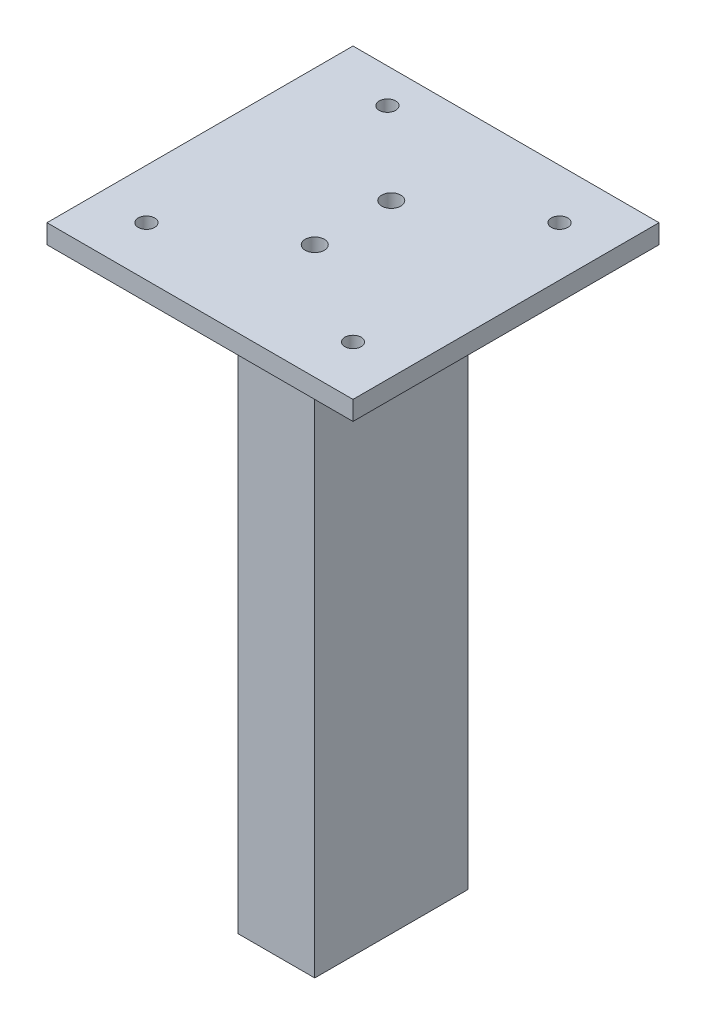
ISO-10303-21;
HEADER;
FILE_DESCRIPTION(('STEP AP214'),'2;1');
FILE_NAME('part.step','',(''),(''),'','','');
FILE_SCHEMA(('AUTOMOTIVE_DESIGN { 1 0 10303 214 1 1 1 1 }'));
ENDSEC;
DATA;
#1=APPLICATION_CONTEXT('core data for automotive mechanical design processes');
#2=APPLICATION_PROTOCOL_DEFINITION('international standard','automotive_design',2000,#1);
#3=PRODUCT_CONTEXT('',#1,'mechanical');
#4=PRODUCT('Part','Part','',(#3));
#5=PRODUCT_RELATED_PRODUCT_CATEGORY('part','',(#4));
#6=PRODUCT_DEFINITION_FORMATION('','',#4);
#7=PRODUCT_DEFINITION_CONTEXT('part definition',#1,'design');
#8=PRODUCT_DEFINITION('design','',#6,#7);
#9=PRODUCT_DEFINITION_SHAPE('','',#8);
#10=(LENGTH_UNIT() NAMED_UNIT(*) SI_UNIT(.MILLI.,.METRE.));
#11=(NAMED_UNIT(*) PLANE_ANGLE_UNIT() SI_UNIT($,.RADIAN.));
#12=(NAMED_UNIT(*) SI_UNIT($,.STERADIAN.) SOLID_ANGLE_UNIT());
#13=UNCERTAINTY_MEASURE_WITH_UNIT(LENGTH_MEASURE(1.E-05),#10,'distance_accuracy_value','');
#14=(GEOMETRIC_REPRESENTATION_CONTEXT(3) GLOBAL_UNCERTAINTY_ASSIGNED_CONTEXT((#13)) GLOBAL_UNIT_ASSIGNED_CONTEXT((#10,
#11,#12)) REPRESENTATION_CONTEXT('',''));
#15=CARTESIAN_POINT('',(0.,0.,0.));
#16=DIRECTION('',(0.,0.,1.));
#17=DIRECTION('',(1.,0.,0.));
#18=AXIS2_PLACEMENT_3D('',#15,#16,#17);
#19=CARTESIAN_POINT('',(10.,151.,20.));
#20=DIRECTION('',(-1.,0.,0.));
#21=DIRECTION('',(0.,0.,1.));
#22=AXIS2_PLACEMENT_3D('',#19,#20,#21);
#23=PLANE('',#22);
#24=DIRECTION('',(0.,0.,-1.));
#25=VECTOR('',#24,1.);
#26=CARTESIAN_POINT('',(10.,0.,20.));
#27=LINE('',#26,#25);
#28=CARTESIAN_POINT('',(10.,0.,20.));
#29=VERTEX_POINT('',#28);
#30=CARTESIAN_POINT('',(10.,0.,-20.));
#31=VERTEX_POINT('',#30);
#32=EDGE_CURVE('E132',#29,#31,#27,.T.);
#33=ORIENTED_EDGE('',*,*,#32,.T.);
#34=DIRECTION('',(0.,-1.,0.));
#35=VECTOR('',#34,1.);
#36=CARTESIAN_POINT('',(10.,151.,-20.));
#37=LINE('',#36,#35);
#38=CARTESIAN_POINT('',(10.,151.,-20.));
#39=VERTEX_POINT('',#38);
#40=EDGE_CURVE('E11',#39,#31,#37,.T.);
#41=ORIENTED_EDGE('',*,*,#40,.F.);
#42=DIRECTION('',(0.,0.,-1.));
#43=VECTOR('',#42,1.);
#44=CARTESIAN_POINT('',(10.,151.,20.));
#45=LINE('',#44,#43);
#46=CARTESIAN_POINT('',(10.,151.,20.));
#47=VERTEX_POINT('',#46);
#48=EDGE_CURVE('E141',#47,#39,#45,.T.);
#49=ORIENTED_EDGE('',*,*,#48,.F.);
#50=DIRECTION('',(0.,-1.,0.));
#51=VECTOR('',#50,1.);
#52=CARTESIAN_POINT('',(10.,151.,20.));
#53=LINE('',#52,#51);
#54=EDGE_CURVE('E150',#47,#29,#53,.T.);
#55=ORIENTED_EDGE('',*,*,#54,.T.);
#56=EDGE_LOOP('',(#33,#41,#49,#55));
#57=FACE_BOUND('',#56,.T.);
#58=ADVANCED_FACE('F34',(#57),#23,.F.);
#59=CARTESIAN_POINT('',(-10.,151.,-20.));
#60=DIRECTION('',(0.,0.,1.));
#61=DIRECTION('',(1.,0.,0.));
#62=AXIS2_PLACEMENT_3D('',#59,#60,#61);
#63=PLANE('',#62);
#64=DIRECTION('',(-1.,0.,0.));
#65=VECTOR('',#64,1.);
#66=CARTESIAN_POINT('',(-10.,0.,-20.));
#67=LINE('',#66,#65);
#68=CARTESIAN_POINT('',(-10.,0.,-20.));
#69=VERTEX_POINT('',#68);
#70=EDGE_CURVE('E135',#31,#69,#67,.T.);
#71=ORIENTED_EDGE('',*,*,#70,.T.);
#72=DIRECTION('',(0.,-1.,0.));
#73=VECTOR('',#72,1.);
#74=CARTESIAN_POINT('',(-10.,151.,-20.));
#75=LINE('',#74,#73);
#76=CARTESIAN_POINT('',(-10.,151.,-20.));
#77=VERTEX_POINT('',#76);
#78=EDGE_CURVE('E42',#77,#69,#75,.T.);
#79=ORIENTED_EDGE('',*,*,#78,.F.);
#80=DIRECTION('',(-1.,0.,0.));
#81=VECTOR('',#80,1.);
#82=CARTESIAN_POINT('',(-10.,151.,-20.));
#83=LINE('',#82,#81);
#84=EDGE_CURVE('E76',#39,#77,#83,.T.);
#85=ORIENTED_EDGE('',*,*,#84,.F.);
#86=ORIENTED_EDGE('',*,*,#40,.T.);
#87=EDGE_LOOP('',(#71,#79,#85,#86));
#88=FACE_BOUND('',#87,.T.);
#89=ADVANCED_FACE('F249',(#88),#63,.F.);
#90=CARTESIAN_POINT('',(-10.,151.,20.));
#91=DIRECTION('',(1.,0.,0.));
#92=DIRECTION('',(0.,0.,-1.));
#93=AXIS2_PLACEMENT_3D('',#90,#91,#92);
#94=PLANE('',#93);
#95=DIRECTION('',(0.,0.,1.));
#96=VECTOR('',#95,1.);
#97=CARTESIAN_POINT('',(-10.,0.,20.));
#98=LINE('',#97,#96);
#99=CARTESIAN_POINT('',(-10.,0.,20.));
#100=VERTEX_POINT('',#99);
#101=EDGE_CURVE('E66',#69,#100,#98,.T.);
#102=ORIENTED_EDGE('',*,*,#101,.T.);
#103=DIRECTION('',(0.,-1.,0.));
#104=VECTOR('',#103,1.);
#105=CARTESIAN_POINT('',(-10.,151.,20.));
#106=LINE('',#105,#104);
#107=CARTESIAN_POINT('',(-10.,151.,20.));
#108=VERTEX_POINT('',#107);
#109=EDGE_CURVE('E50',#108,#100,#106,.T.);
#110=ORIENTED_EDGE('',*,*,#109,.F.);
#111=DIRECTION('',(0.,0.,1.));
#112=VECTOR('',#111,1.);
#113=CARTESIAN_POINT('',(-10.,151.,20.));
#114=LINE('',#113,#112);
#115=EDGE_CURVE('E145',#77,#108,#114,.T.);
#116=ORIENTED_EDGE('',*,*,#115,.F.);
#117=ORIENTED_EDGE('',*,*,#78,.T.);
#118=EDGE_LOOP('',(#102,#110,#116,#117));
#119=FACE_BOUND('',#118,.T.);
#120=ADVANCED_FACE('F156',(#119),#94,.F.);
#121=CARTESIAN_POINT('',(-10.,151.,20.));
#122=DIRECTION('',(0.,0.,-1.));
#123=DIRECTION('',(-1.,0.,0.));
#124=AXIS2_PLACEMENT_3D('',#121,#122,#123);
#125=PLANE('',#124);
#126=DIRECTION('',(1.,0.,0.));
#127=VECTOR('',#126,1.);
#128=CARTESIAN_POINT('',(-10.,0.,20.));
#129=LINE('',#128,#127);
#130=EDGE_CURVE('E71',#100,#29,#129,.T.);
#131=ORIENTED_EDGE('',*,*,#130,.T.);
#132=ORIENTED_EDGE('',*,*,#54,.F.);
#133=DIRECTION('',(1.,0.,0.));
#134=VECTOR('',#133,1.);
#135=CARTESIAN_POINT('',(-10.,151.,20.));
#136=LINE('',#135,#134);
#137=EDGE_CURVE('E148',#108,#47,#136,.T.);
#138=ORIENTED_EDGE('',*,*,#137,.F.);
#139=ORIENTED_EDGE('',*,*,#109,.T.);
#140=EDGE_LOOP('',(#131,#132,#138,#139));
#141=FACE_BOUND('',#140,.T.);
#142=ADVANCED_FACE('F161',(#141),#125,.F.);
#143=CARTESIAN_POINT('',(0.,0.,0.));
#144=DIRECTION('',(0.,-1.,0.));
#145=DIRECTION('',(0.,0.,-1.));
#146=AXIS2_PLACEMENT_3D('',#143,#144,#145);
#147=PLANE('',#146);
#148=CARTESIAN_POINT('',(0.,0.,-10.));
#149=DIRECTION('',(0.,1.,0.));
#150=DIRECTION('',(0.,0.,1.));
#151=AXIS2_PLACEMENT_3D('',#148,#149,#150);
#152=CIRCLE('',#151,2.5);
#153=CARTESIAN_POINT('',(0.,0.,-7.5));
#154=VERTEX_POINT('',#153);
#155=EDGE_CURVE('E172',#154,#154,#152,.T.);
#156=ORIENTED_EDGE('',*,*,#155,.T.);
#157=EDGE_LOOP('',(#156));
#158=FACE_BOUND('',#157,.T.);
#159=CARTESIAN_POINT('',(0.,0.,10.));
#160=DIRECTION('',(0.,1.,0.));
#161=DIRECTION('',(0.,0.,1.));
#162=AXIS2_PLACEMENT_3D('',#159,#160,#161);
#163=CIRCLE('',#162,2.5);
#164=CARTESIAN_POINT('',(0.,0.,12.5));
#165=VERTEX_POINT('',#164);
#166=EDGE_CURVE('E195',#165,#165,#163,.T.);
#167=ORIENTED_EDGE('',*,*,#166,.T.);
#168=EDGE_LOOP('',(#167));
#169=FACE_BOUND('',#168,.T.);
#170=ORIENTED_EDGE('',*,*,#32,.F.);
#171=ORIENTED_EDGE('',*,*,#130,.F.);
#172=ORIENTED_EDGE('',*,*,#101,.F.);
#173=ORIENTED_EDGE('',*,*,#70,.F.);
#174=EDGE_LOOP('',(#170,#171,#172,#173));
#175=FACE_BOUND('',#174,.T.);
#176=ADVANCED_FACE('F159',(#158,#169,#175),#147,.T.);
#177=CARTESIAN_POINT('',(40.,156.,40.));
#178=DIRECTION('',(-1.,0.,0.));
#179=DIRECTION('',(0.,0.,1.));
#180=AXIS2_PLACEMENT_3D('',#177,#178,#179);
#181=PLANE('',#180);
#182=DIRECTION('',(0.,0.,-1.));
#183=VECTOR('',#182,1.);
#184=CARTESIAN_POINT('',(40.,151.,40.));
#185=LINE('',#184,#183);
#186=CARTESIAN_POINT('',(40.,151.,40.));
#187=VERTEX_POINT('',#186);
#188=CARTESIAN_POINT('',(40.,151.,-40.));
#189=VERTEX_POINT('',#188);
#190=EDGE_CURVE('E131',#187,#189,#185,.T.);
#191=ORIENTED_EDGE('',*,*,#190,.T.);
#192=DIRECTION('',(0.,-1.,0.));
#193=VECTOR('',#192,1.);
#194=CARTESIAN_POINT('',(40.,156.,-40.));
#195=LINE('',#194,#193);
#196=CARTESIAN_POINT('',(40.,156.,-40.));
#197=VERTEX_POINT('',#196);
#198=EDGE_CURVE('E111',#197,#189,#195,.T.);
#199=ORIENTED_EDGE('',*,*,#198,.F.);
#200=DIRECTION('',(0.,0.,-1.));
#201=VECTOR('',#200,1.);
#202=CARTESIAN_POINT('',(40.,156.,40.));
#203=LINE('',#202,#201);
#204=CARTESIAN_POINT('',(40.,156.,40.));
#205=VERTEX_POINT('',#204);
#206=EDGE_CURVE('E118',#205,#197,#203,.T.);
#207=ORIENTED_EDGE('',*,*,#206,.F.);
#208=DIRECTION('',(0.,-1.,0.));
#209=VECTOR('',#208,1.);
#210=CARTESIAN_POINT('',(40.,156.,40.));
#211=LINE('',#210,#209);
#212=EDGE_CURVE('E184',#205,#187,#211,.T.);
#213=ORIENTED_EDGE('',*,*,#212,.T.);
#214=EDGE_LOOP('',(#191,#199,#207,#213));
#215=FACE_BOUND('',#214,.T.);
#216=ADVANCED_FACE('F129',(#215),#181,.F.);
#217=CARTESIAN_POINT('',(-40.,156.,-40.));
#218=DIRECTION('',(0.,0.,1.));
#219=DIRECTION('',(1.,0.,0.));
#220=AXIS2_PLACEMENT_3D('',#217,#218,#219);
#221=PLANE('',#220);
#222=DIRECTION('',(-1.,0.,0.));
#223=VECTOR('',#222,1.);
#224=CARTESIAN_POINT('',(-40.,151.,-40.));
#225=LINE('',#224,#223);
#226=CARTESIAN_POINT('',(-40.,151.,-40.));
#227=VERTEX_POINT('',#226);
#228=EDGE_CURVE('E171',#189,#227,#225,.T.);
#229=ORIENTED_EDGE('',*,*,#228,.T.);
#230=DIRECTION('',(0.,-1.,0.));
#231=VECTOR('',#230,1.);
#232=CARTESIAN_POINT('',(-40.,156.,-40.));
#233=LINE('',#232,#231);
#234=CARTESIAN_POINT('',(-40.,156.,-40.));
#235=VERTEX_POINT('',#234);
#236=EDGE_CURVE('E114',#235,#227,#233,.T.);
#237=ORIENTED_EDGE('',*,*,#236,.F.);
#238=DIRECTION('',(-1.,0.,0.));
#239=VECTOR('',#238,1.);
#240=CARTESIAN_POINT('',(-40.,156.,-40.));
#241=LINE('',#240,#239);
#242=EDGE_CURVE('E107',#197,#235,#241,.T.);
#243=ORIENTED_EDGE('',*,*,#242,.F.);
#244=ORIENTED_EDGE('',*,*,#198,.T.);
#245=EDGE_LOOP('',(#229,#237,#243,#244));
#246=FACE_BOUND('',#245,.T.);
#247=ADVANCED_FACE('F109',(#246),#221,.F.);
#248=CARTESIAN_POINT('',(-40.,156.,40.));
#249=DIRECTION('',(1.,0.,0.));
#250=DIRECTION('',(0.,0.,-1.));
#251=AXIS2_PLACEMENT_3D('',#248,#249,#250);
#252=PLANE('',#251);
#253=DIRECTION('',(0.,0.,1.));
#254=VECTOR('',#253,1.);
#255=CARTESIAN_POINT('',(-40.,151.,40.));
#256=LINE('',#255,#254);
#257=CARTESIAN_POINT('',(-40.,151.,40.));
#258=VERTEX_POINT('',#257);
#259=EDGE_CURVE('E174',#227,#258,#256,.T.);
#260=ORIENTED_EDGE('',*,*,#259,.T.);
#261=DIRECTION('',(0.,-1.,0.));
#262=VECTOR('',#261,1.);
#263=CARTESIAN_POINT('',(-40.,156.,40.));
#264=LINE('',#263,#262);
#265=CARTESIAN_POINT('',(-40.,156.,40.));
#266=VERTEX_POINT('',#265);
#267=EDGE_CURVE('E137',#266,#258,#264,.T.);
#268=ORIENTED_EDGE('',*,*,#267,.F.);
#269=DIRECTION('',(0.,0.,1.));
#270=VECTOR('',#269,1.);
#271=CARTESIAN_POINT('',(-40.,156.,40.));
#272=LINE('',#271,#270);
#273=EDGE_CURVE('E117',#235,#266,#272,.T.);
#274=ORIENTED_EDGE('',*,*,#273,.F.);
#275=ORIENTED_EDGE('',*,*,#236,.T.);
#276=EDGE_LOOP('',(#260,#268,#274,#275));
#277=FACE_BOUND('',#276,.T.);
#278=ADVANCED_FACE('F190',(#277),#252,.F.);
#279=CARTESIAN_POINT('',(-40.,156.,40.));
#280=DIRECTION('',(0.,0.,-1.));
#281=DIRECTION('',(-1.,0.,0.));
#282=AXIS2_PLACEMENT_3D('',#279,#280,#281);
#283=PLANE('',#282);
#284=DIRECTION('',(1.,0.,0.));
#285=VECTOR('',#284,1.);
#286=CARTESIAN_POINT('',(-40.,151.,40.));
#287=LINE('',#286,#285);
#288=EDGE_CURVE('E127',#258,#187,#287,.T.);
#289=ORIENTED_EDGE('',*,*,#288,.T.);
#290=ORIENTED_EDGE('',*,*,#212,.F.);
#291=DIRECTION('',(1.,0.,0.));
#292=VECTOR('',#291,1.);
#293=CARTESIAN_POINT('',(-40.,156.,40.));
#294=LINE('',#293,#292);
#295=EDGE_CURVE('E123',#266,#205,#294,.T.);
#296=ORIENTED_EDGE('',*,*,#295,.F.);
#297=ORIENTED_EDGE('',*,*,#267,.T.);
#298=EDGE_LOOP('',(#289,#290,#296,#297));
#299=FACE_BOUND('',#298,.T.);
#300=ADVANCED_FACE('F188',(#299),#283,.F.);
#301=CARTESIAN_POINT('',(0.,156.,0.));
#302=DIRECTION('',(0.,-1.,0.));
#303=DIRECTION('',(0.,0.,-1.));
#304=AXIS2_PLACEMENT_3D('',#301,#302,#303);
#305=PLANE('',#304);
#306=CARTESIAN_POINT('',(27.,156.,-27.));
#307=DIRECTION('',(0.,1.,0.));
#308=DIRECTION('',(0.,0.,1.));
#309=AXIS2_PLACEMENT_3D('',#306,#307,#308);
#310=CIRCLE('',#309,2.15);
#311=CARTESIAN_POINT('',(27.,156.,-24.85));
#312=VERTEX_POINT('',#311);
#313=EDGE_CURVE('E204',#312,#312,#310,.T.);
#314=ORIENTED_EDGE('',*,*,#313,.F.);
#315=EDGE_LOOP('',(#314));
#316=FACE_BOUND('',#315,.T.);
#317=CARTESIAN_POINT('',(-27.,156.,27.));
#318=DIRECTION('',(0.,1.,0.));
#319=DIRECTION('',(0.,0.,1.));
#320=AXIS2_PLACEMENT_3D('',#317,#318,#319);
#321=CIRCLE('',#320,2.15);
#322=CARTESIAN_POINT('',(-27.,156.,29.15));
#323=VERTEX_POINT('',#322);
#324=EDGE_CURVE('E210',#323,#323,#321,.T.);
#325=ORIENTED_EDGE('',*,*,#324,.F.);
#326=EDGE_LOOP('',(#325));
#327=FACE_BOUND('',#326,.T.);
#328=CARTESIAN_POINT('',(27.,156.,27.));
#329=DIRECTION('',(0.,1.,0.));
#330=DIRECTION('',(0.,0.,1.));
#331=AXIS2_PLACEMENT_3D('',#328,#329,#330);
#332=CIRCLE('',#331,2.15);
#333=CARTESIAN_POINT('',(27.,156.,29.15));
#334=VERTEX_POINT('',#333);
#335=EDGE_CURVE('E211',#334,#334,#332,.T.);
#336=ORIENTED_EDGE('',*,*,#335,.F.);
#337=EDGE_LOOP('',(#336));
#338=FACE_BOUND('',#337,.T.);
#339=CARTESIAN_POINT('',(-22.,156.,-31.));
#340=DIRECTION('',(0.,1.,0.));
#341=DIRECTION('',(0.,0.,1.));
#342=AXIS2_PLACEMENT_3D('',#339,#340,#341);
#343=CIRCLE('',#342,2.15);
#344=CARTESIAN_POINT('',(-22.,156.,-28.85));
#345=VERTEX_POINT('',#344);
#346=EDGE_CURVE('E196',#345,#345,#343,.T.);
#347=ORIENTED_EDGE('',*,*,#346,.F.);
#348=EDGE_LOOP('',(#347));
#349=FACE_BOUND('',#348,.T.);
#350=CARTESIAN_POINT('',(0.,156.,-10.));
#351=DIRECTION('',(0.,1.,0.));
#352=DIRECTION('',(0.,0.,1.));
#353=AXIS2_PLACEMENT_3D('',#350,#351,#352);
#354=CIRCLE('',#353,2.5);
#355=CARTESIAN_POINT('',(0.,156.,-7.5));
#356=VERTEX_POINT('',#355);
#357=EDGE_CURVE('E177',#356,#356,#354,.T.);
#358=ORIENTED_EDGE('',*,*,#357,.F.);
#359=EDGE_LOOP('',(#358));
#360=FACE_BOUND('',#359,.T.);
#361=CARTESIAN_POINT('',(0.,156.,10.));
#362=DIRECTION('',(0.,1.,0.));
#363=DIRECTION('',(0.,0.,1.));
#364=AXIS2_PLACEMENT_3D('',#361,#362,#363);
#365=CIRCLE('',#364,2.5);
#366=CARTESIAN_POINT('',(0.,156.,12.5));
#367=VERTEX_POINT('',#366);
#368=EDGE_CURVE('E192',#367,#367,#365,.T.);
#369=ORIENTED_EDGE('',*,*,#368,.F.);
#370=EDGE_LOOP('',(#369));
#371=FACE_BOUND('',#370,.T.);
#372=ORIENTED_EDGE('',*,*,#206,.T.);
#373=ORIENTED_EDGE('',*,*,#242,.T.);
#374=ORIENTED_EDGE('',*,*,#273,.T.);
#375=ORIENTED_EDGE('',*,*,#295,.T.);
#376=EDGE_LOOP('',(#372,#373,#374,#375));
#377=FACE_BOUND('',#376,.T.);
#378=ADVANCED_FACE('F121',(#316,#327,#338,#349,#360,#371,#377),#305,.F.);
#379=CARTESIAN_POINT('',(0.,151.,0.));
#380=DIRECTION('',(0.,-1.,0.));
#381=DIRECTION('',(0.,0.,-1.));
#382=AXIS2_PLACEMENT_3D('',#379,#380,#381);
#383=PLANE('',#382);
#384=CARTESIAN_POINT('',(27.,151.,-27.));
#385=DIRECTION('',(0.,-1.,0.));
#386=DIRECTION('',(0.,0.,-1.));
#387=AXIS2_PLACEMENT_3D('',#384,#385,#386);
#388=CIRCLE('',#387,2.15);
#389=CARTESIAN_POINT('',(27.,151.,-24.85));
#390=VERTEX_POINT('',#389);
#391=EDGE_CURVE('E214',#390,#390,#388,.F.);
#392=ORIENTED_EDGE('',*,*,#391,.T.);
#393=EDGE_LOOP('',(#392));
#394=FACE_BOUND('',#393,.T.);
#395=CARTESIAN_POINT('',(-27.,151.,27.));
#396=DIRECTION('',(0.,-1.,0.));
#397=DIRECTION('',(0.,0.,-1.));
#398=AXIS2_PLACEMENT_3D('',#395,#396,#397);
#399=CIRCLE('',#398,2.15);
#400=CARTESIAN_POINT('',(-27.,151.,29.15));
#401=VERTEX_POINT('',#400);
#402=EDGE_CURVE('E207',#401,#401,#399,.F.);
#403=ORIENTED_EDGE('',*,*,#402,.T.);
#404=EDGE_LOOP('',(#403));
#405=FACE_BOUND('',#404,.T.);
#406=CARTESIAN_POINT('',(27.,151.,27.));
#407=DIRECTION('',(0.,-1.,0.));
#408=DIRECTION('',(0.,0.,-1.));
#409=AXIS2_PLACEMENT_3D('',#406,#407,#408);
#410=CIRCLE('',#409,2.15);
#411=CARTESIAN_POINT('',(27.,151.,29.15));
#412=VERTEX_POINT('',#411);
#413=EDGE_CURVE('E219',#412,#412,#410,.F.);
#414=ORIENTED_EDGE('',*,*,#413,.T.);
#415=EDGE_LOOP('',(#414));
#416=FACE_BOUND('',#415,.T.);
#417=CARTESIAN_POINT('',(-22.,151.,-31.));
#418=DIRECTION('',(0.,-1.,0.));
#419=DIRECTION('',(0.,0.,-1.));
#420=AXIS2_PLACEMENT_3D('',#417,#418,#419);
#421=CIRCLE('',#420,2.15);
#422=CARTESIAN_POINT('',(-22.,151.,-28.85));
#423=VERTEX_POINT('',#422);
#424=EDGE_CURVE('E201',#423,#423,#421,.F.);
#425=ORIENTED_EDGE('',*,*,#424,.T.);
#426=EDGE_LOOP('',(#425));
#427=FACE_BOUND('',#426,.T.);
#428=ORIENTED_EDGE('',*,*,#137,.T.);
#429=ORIENTED_EDGE('',*,*,#48,.T.);
#430=ORIENTED_EDGE('',*,*,#84,.T.);
#431=ORIENTED_EDGE('',*,*,#115,.T.);
#432=EDGE_LOOP('',(#428,#429,#430,#431));
#433=FACE_BOUND('',#432,.T.);
#434=ORIENTED_EDGE('',*,*,#190,.F.);
#435=ORIENTED_EDGE('',*,*,#288,.F.);
#436=ORIENTED_EDGE('',*,*,#259,.F.);
#437=ORIENTED_EDGE('',*,*,#228,.F.);
#438=EDGE_LOOP('',(#434,#435,#436,#437));
#439=FACE_BOUND('',#438,.T.);
#440=ADVANCED_FACE('F163',(#394,#405,#416,#427,#433,#439),#383,.T.);
#441=CARTESIAN_POINT('',(0.,0.,10.));
#442=DIRECTION('',(0.,1.,0.));
#443=DIRECTION('',(0.,0.,1.));
#444=AXIS2_PLACEMENT_3D('',#441,#442,#443);
#445=CYLINDRICAL_SURFACE('',#444,2.5);
#446=ORIENTED_EDGE('',*,*,#166,.F.);
#447=EDGE_LOOP('',(#446));
#448=FACE_BOUND('',#447,.T.);
#449=ORIENTED_EDGE('',*,*,#368,.T.);
#450=EDGE_LOOP('',(#449));
#451=FACE_BOUND('',#450,.T.);
#452=ADVANCED_FACE('F166',(#448,#451),#445,.F.);
#453=CARTESIAN_POINT('',(0.,0.,-10.));
#454=DIRECTION('',(0.,1.,0.));
#455=DIRECTION('',(0.,0.,1.));
#456=AXIS2_PLACEMENT_3D('',#453,#454,#455);
#457=CYLINDRICAL_SURFACE('',#456,2.5);
#458=ORIENTED_EDGE('',*,*,#155,.F.);
#459=EDGE_LOOP('',(#458));
#460=FACE_BOUND('',#459,.T.);
#461=ORIENTED_EDGE('',*,*,#357,.T.);
#462=EDGE_LOOP('',(#461));
#463=FACE_BOUND('',#462,.T.);
#464=ADVANCED_FACE('F238',(#460,#463),#457,.F.);
#465=CARTESIAN_POINT('',(-22.,-0.001000000000001,-31.));
#466=DIRECTION('',(0.,1.,0.));
#467=DIRECTION('',(0.,0.,1.));
#468=AXIS2_PLACEMENT_3D('',#465,#466,#467);
#469=CYLINDRICAL_SURFACE('',#468,2.15);
#470=CARTESIAN_POINT('',(-22.,151.,-28.85));
#471=CARTESIAN_POINT('',(-22.,151.052083333333,-28.85));
#472=CARTESIAN_POINT('',(-22.,151.104166666667,-28.85));
#473=CARTESIAN_POINT('',(-22.,151.208333333333,-28.85));
#474=CARTESIAN_POINT('',(-22.,151.260416666667,-28.85));
#475=CARTESIAN_POINT('',(-22.,151.364583333333,-28.85));
#476=CARTESIAN_POINT('',(-22.,151.416666666667,-28.85));
#477=CARTESIAN_POINT('',(-22.,151.520833333333,-28.85));
#478=CARTESIAN_POINT('',(-22.,151.572916666667,-28.85));
#479=CARTESIAN_POINT('',(-22.,151.677083333333,-28.85));
#480=CARTESIAN_POINT('',(-22.,151.729166666667,-28.85));
#481=CARTESIAN_POINT('',(-22.,151.833333333333,-28.85));
#482=CARTESIAN_POINT('',(-22.,151.885416666667,-28.85));
#483=CARTESIAN_POINT('',(-22.,151.989583333333,-28.85));
#484=CARTESIAN_POINT('',(-22.,152.041666666667,-28.85));
#485=CARTESIAN_POINT('',(-22.,152.145833333333,-28.85));
#486=CARTESIAN_POINT('',(-22.,152.197916666667,-28.85));
#487=CARTESIAN_POINT('',(-22.,152.302083333333,-28.85));
#488=CARTESIAN_POINT('',(-22.,152.354166666667,-28.85));
#489=CARTESIAN_POINT('',(-22.,152.458333333333,-28.85));
#490=CARTESIAN_POINT('',(-22.,152.510416666667,-28.85));
#491=CARTESIAN_POINT('',(-22.,152.614583333333,-28.85));
#492=CARTESIAN_POINT('',(-22.,152.666666666667,-28.85));
#493=CARTESIAN_POINT('',(-22.,152.770833333333,-28.85));
#494=CARTESIAN_POINT('',(-22.,152.822916666667,-28.85));
#495=CARTESIAN_POINT('',(-22.,152.927083333333,-28.85));
#496=CARTESIAN_POINT('',(-22.,152.979166666667,-28.85));
#497=CARTESIAN_POINT('',(-22.,153.083333333333,-28.85));
#498=CARTESIAN_POINT('',(-22.,153.135416666667,-28.85));
#499=CARTESIAN_POINT('',(-22.,153.239583333333,-28.85));
#500=CARTESIAN_POINT('',(-22.,153.291666666667,-28.85));
#501=CARTESIAN_POINT('',(-22.,153.395833333333,-28.85));
#502=CARTESIAN_POINT('',(-22.,153.447916666667,-28.85));
#503=CARTESIAN_POINT('',(-22.,153.552083333333,-28.85));
#504=CARTESIAN_POINT('',(-22.,153.604166666667,-28.85));
#505=CARTESIAN_POINT('',(-22.,153.708333333333,-28.85));
#506=CARTESIAN_POINT('',(-22.,153.760416666667,-28.85));
#507=CARTESIAN_POINT('',(-22.,153.864583333333,-28.85));
#508=CARTESIAN_POINT('',(-22.,153.916666666667,-28.85));
#509=CARTESIAN_POINT('',(-22.,154.020833333333,-28.85));
#510=CARTESIAN_POINT('',(-22.,154.072916666667,-28.85));
#511=CARTESIAN_POINT('',(-22.,154.177083333333,-28.85));
#512=CARTESIAN_POINT('',(-22.,154.229166666667,-28.85));
#513=CARTESIAN_POINT('',(-22.,154.333333333333,-28.85));
#514=CARTESIAN_POINT('',(-22.,154.385416666667,-28.85));
#515=CARTESIAN_POINT('',(-22.,154.489583333333,-28.85));
#516=CARTESIAN_POINT('',(-22.,154.541666666667,-28.85));
#517=CARTESIAN_POINT('',(-22.,154.645833333333,-28.85));
#518=CARTESIAN_POINT('',(-22.,154.697916666667,-28.85));
#519=CARTESIAN_POINT('',(-22.,154.802083333333,-28.85));
#520=CARTESIAN_POINT('',(-22.,154.854166666667,-28.85));
#521=CARTESIAN_POINT('',(-22.,154.958333333333,-28.85));
#522=CARTESIAN_POINT('',(-22.,155.010416666667,-28.85));
#523=CARTESIAN_POINT('',(-22.,155.114583333333,-28.85));
#524=CARTESIAN_POINT('',(-22.,155.166666666667,-28.85));
#525=CARTESIAN_POINT('',(-22.,155.270833333333,-28.85));
#526=CARTESIAN_POINT('',(-22.,155.322916666667,-28.85));
#527=CARTESIAN_POINT('',(-22.,155.427083333333,-28.85));
#528=CARTESIAN_POINT('',(-22.,155.479166666667,-28.85));
#529=CARTESIAN_POINT('',(-22.,155.583333333333,-28.85));
#530=CARTESIAN_POINT('',(-22.,155.635416666667,-28.85));
#531=CARTESIAN_POINT('',(-22.,155.739583333333,-28.85));
#532=CARTESIAN_POINT('',(-22.,155.791666666667,-28.85));
#533=CARTESIAN_POINT('',(-22.,155.895833333333,-28.85));
#534=CARTESIAN_POINT('',(-22.,155.947916666667,-28.85));
#535=CARTESIAN_POINT('',(-22.,156.,-28.85));
#536=B_SPLINE_CURVE_WITH_KNOTS('',3,(#470,#471,#472,#473,#474,#475,#476,#477,#478,#479,#480,
#481,#482,#483,#484,#485,#486,#487,#488,#489,#490,#491,#492,#493,#494,#495,#496,#497,#498,#499,
#500,#501,#502,#503,#504,#505,#506,#507,#508,#509,#510,#511,#512,#513,#514,#515,#516,#517,#518,
#519,#520,#521,#522,#523,#524,#525,#526,#527,#528,#529,#530,#531,#532,#533,#534,#535),
.UNSPECIFIED.,.F.,.F.,(4,2,2,2,2,2,2,2,2,2,2,2,2,2,2,2,2,2,2,2,2,2,2,2,2,2,2,2,2,2,2,2,4),(0.,
0.156249999999997,0.312499999999993,0.46874999999999,0.624999999999987,0.781249999999983,
0.93749999999998,1.09374999999998,1.24999999999997,1.40625,1.56249999999999,1.71874999999999,
1.87499999999999,2.03124999999998,2.18749999999998,2.34374999999998,2.49999999999997,
2.65624999999997,2.81249999999997,2.96874999999996,3.12499999999996,3.28124999999996,
3.43749999999995,3.59374999999995,3.74999999999998,3.90624999999997,4.06249999999997,
4.21874999999997,4.37499999999996,4.53124999999996,4.68749999999996,4.84374999999995,
4.99999999999995),.UNSPECIFIED.);
#537=EDGE_CURVE('BSEAM244',#423,#345,#536,.T.);
#538=ORIENTED_EDGE('',*,*,#424,.F.);
#539=ORIENTED_EDGE('',*,*,#346,.T.);
#540=ORIENTED_EDGE('',*,*,#537,.T.);
#541=ORIENTED_EDGE('',*,*,#537,.F.);
#542=EDGE_LOOP('',(#538,#540,#539,#541));
#543=FACE_BOUND('',#542,.T.);
#544=ADVANCED_FACE('F244',(#543),#469,.F.);
#545=CARTESIAN_POINT('',(27.,-0.001000000000001,27.));
#546=DIRECTION('',(0.,1.,0.));
#547=DIRECTION('',(0.,0.,1.));
#548=AXIS2_PLACEMENT_3D('',#545,#546,#547);
#549=CYLINDRICAL_SURFACE('',#548,2.15);
#550=CARTESIAN_POINT('',(27.,151.,29.15));
#551=CARTESIAN_POINT('',(27.,151.052083333333,29.15));
#552=CARTESIAN_POINT('',(27.,151.104166666667,29.15));
#553=CARTESIAN_POINT('',(27.,151.208333333333,29.15));
#554=CARTESIAN_POINT('',(27.,151.260416666667,29.15));
#555=CARTESIAN_POINT('',(27.,151.364583333333,29.15));
#556=CARTESIAN_POINT('',(27.,151.416666666667,29.15));
#557=CARTESIAN_POINT('',(27.,151.520833333333,29.15));
#558=CARTESIAN_POINT('',(27.,151.572916666667,29.15));
#559=CARTESIAN_POINT('',(27.,151.677083333333,29.15));
#560=CARTESIAN_POINT('',(27.,151.729166666667,29.15));
#561=CARTESIAN_POINT('',(27.,151.833333333333,29.15));
#562=CARTESIAN_POINT('',(27.,151.885416666667,29.15));
#563=CARTESIAN_POINT('',(27.,151.989583333333,29.15));
#564=CARTESIAN_POINT('',(27.,152.041666666667,29.15));
#565=CARTESIAN_POINT('',(27.,152.145833333333,29.15));
#566=CARTESIAN_POINT('',(27.,152.197916666667,29.15));
#567=CARTESIAN_POINT('',(27.,152.302083333333,29.15));
#568=CARTESIAN_POINT('',(27.,152.354166666667,29.15));
#569=CARTESIAN_POINT('',(27.,152.458333333333,29.15));
#570=CARTESIAN_POINT('',(27.,152.510416666667,29.15));
#571=CARTESIAN_POINT('',(27.,152.614583333333,29.15));
#572=CARTESIAN_POINT('',(27.,152.666666666667,29.15));
#573=CARTESIAN_POINT('',(27.,152.770833333333,29.15));
#574=CARTESIAN_POINT('',(27.,152.822916666667,29.15));
#575=CARTESIAN_POINT('',(27.,152.927083333333,29.15));
#576=CARTESIAN_POINT('',(27.,152.979166666667,29.15));
#577=CARTESIAN_POINT('',(27.,153.083333333333,29.15));
#578=CARTESIAN_POINT('',(27.,153.135416666667,29.15));
#579=CARTESIAN_POINT('',(27.,153.239583333333,29.15));
#580=CARTESIAN_POINT('',(27.,153.291666666667,29.15));
#581=CARTESIAN_POINT('',(27.,153.395833333333,29.15));
#582=CARTESIAN_POINT('',(27.,153.447916666667,29.15));
#583=CARTESIAN_POINT('',(27.,153.552083333333,29.15));
#584=CARTESIAN_POINT('',(27.,153.604166666667,29.15));
#585=CARTESIAN_POINT('',(27.,153.708333333333,29.15));
#586=CARTESIAN_POINT('',(27.,153.760416666667,29.15));
#587=CARTESIAN_POINT('',(27.,153.864583333333,29.15));
#588=CARTESIAN_POINT('',(27.,153.916666666667,29.15));
#589=CARTESIAN_POINT('',(27.,154.020833333333,29.15));
#590=CARTESIAN_POINT('',(27.,154.072916666667,29.15));
#591=CARTESIAN_POINT('',(27.,154.177083333333,29.15));
#592=CARTESIAN_POINT('',(27.,154.229166666667,29.15));
#593=CARTESIAN_POINT('',(27.,154.333333333333,29.15));
#594=CARTESIAN_POINT('',(27.,154.385416666667,29.15));
#595=CARTESIAN_POINT('',(27.,154.489583333333,29.15));
#596=CARTESIAN_POINT('',(27.,154.541666666667,29.15));
#597=CARTESIAN_POINT('',(27.,154.645833333333,29.15));
#598=CARTESIAN_POINT('',(27.,154.697916666667,29.15));
#599=CARTESIAN_POINT('',(27.,154.802083333333,29.15));
#600=CARTESIAN_POINT('',(27.,154.854166666667,29.15));
#601=CARTESIAN_POINT('',(27.,154.958333333333,29.15));
#602=CARTESIAN_POINT('',(27.,155.010416666667,29.15));
#603=CARTESIAN_POINT('',(27.,155.114583333333,29.15));
#604=CARTESIAN_POINT('',(27.,155.166666666667,29.15));
#605=CARTESIAN_POINT('',(27.,155.270833333333,29.15));
#606=CARTESIAN_POINT('',(27.,155.322916666667,29.15));
#607=CARTESIAN_POINT('',(27.,155.427083333333,29.15));
#608=CARTESIAN_POINT('',(27.,155.479166666667,29.15));
#609=CARTESIAN_POINT('',(27.,155.583333333333,29.15));
#610=CARTESIAN_POINT('',(27.,155.635416666667,29.15));
#611=CARTESIAN_POINT('',(27.,155.739583333333,29.15));
#612=CARTESIAN_POINT('',(27.,155.791666666667,29.15));
#613=CARTESIAN_POINT('',(27.,155.895833333333,29.15));
#614=CARTESIAN_POINT('',(27.,155.947916666667,29.15));
#615=CARTESIAN_POINT('',(27.,156.,29.15));
#616=B_SPLINE_CURVE_WITH_KNOTS('',3,(#550,#551,#552,#553,#554,#555,#556,#557,#558,#559,#560,
#561,#562,#563,#564,#565,#566,#567,#568,#569,#570,#571,#572,#573,#574,#575,#576,#577,#578,#579,
#580,#581,#582,#583,#584,#585,#586,#587,#588,#589,#590,#591,#592,#593,#594,#595,#596,#597,#598,
#599,#600,#601,#602,#603,#604,#605,#606,#607,#608,#609,#610,#611,#612,#613,#614,#615),
.UNSPECIFIED.,.F.,.F.,(4,2,2,2,2,2,2,2,2,2,2,2,2,2,2,2,2,2,2,2,2,2,2,2,2,2,2,2,2,2,2,2,4),(0.,
0.156249999999997,0.312499999999993,0.46874999999999,0.624999999999987,0.781249999999983,
0.93749999999998,1.09374999999998,1.24999999999997,1.40625,1.56249999999999,1.71874999999999,
1.87499999999999,2.03124999999998,2.18749999999998,2.34374999999998,2.49999999999997,
2.65624999999997,2.81249999999997,2.96874999999996,3.12499999999996,3.28124999999996,
3.43749999999995,3.59374999999995,3.74999999999998,3.90624999999997,4.06249999999997,
4.21874999999997,4.37499999999996,4.53124999999996,4.68749999999996,4.84374999999995,
4.99999999999995),.UNSPECIFIED.);
#617=EDGE_CURVE('BSEAM225',#412,#334,#616,.T.);
#618=ORIENTED_EDGE('',*,*,#413,.F.);
#619=ORIENTED_EDGE('',*,*,#335,.T.);
#620=ORIENTED_EDGE('',*,*,#617,.T.);
#621=ORIENTED_EDGE('',*,*,#617,.F.);
#622=EDGE_LOOP('',(#618,#620,#619,#621));
#623=FACE_BOUND('',#622,.T.);
#624=ADVANCED_FACE('F225',(#623),#549,.F.);
#625=CARTESIAN_POINT('',(-27.,-0.001000000000001,27.));
#626=DIRECTION('',(0.,1.,0.));
#627=DIRECTION('',(0.,0.,1.));
#628=AXIS2_PLACEMENT_3D('',#625,#626,#627);
#629=CYLINDRICAL_SURFACE('',#628,2.15);
#630=CARTESIAN_POINT('',(-27.,151.,29.15));
#631=CARTESIAN_POINT('',(-27.,151.052083333333,29.15));
#632=CARTESIAN_POINT('',(-27.,151.104166666667,29.15));
#633=CARTESIAN_POINT('',(-27.,151.208333333333,29.15));
#634=CARTESIAN_POINT('',(-27.,151.260416666667,29.15));
#635=CARTESIAN_POINT('',(-27.,151.364583333333,29.15));
#636=CARTESIAN_POINT('',(-27.,151.416666666667,29.15));
#637=CARTESIAN_POINT('',(-27.,151.520833333333,29.15));
#638=CARTESIAN_POINT('',(-27.,151.572916666667,29.15));
#639=CARTESIAN_POINT('',(-27.,151.677083333333,29.15));
#640=CARTESIAN_POINT('',(-27.,151.729166666667,29.15));
#641=CARTESIAN_POINT('',(-27.,151.833333333333,29.15));
#642=CARTESIAN_POINT('',(-27.,151.885416666667,29.15));
#643=CARTESIAN_POINT('',(-27.,151.989583333333,29.15));
#644=CARTESIAN_POINT('',(-27.,152.041666666667,29.15));
#645=CARTESIAN_POINT('',(-27.,152.145833333333,29.15));
#646=CARTESIAN_POINT('',(-27.,152.197916666667,29.15));
#647=CARTESIAN_POINT('',(-27.,152.302083333333,29.15));
#648=CARTESIAN_POINT('',(-27.,152.354166666667,29.15));
#649=CARTESIAN_POINT('',(-27.,152.458333333333,29.15));
#650=CARTESIAN_POINT('',(-27.,152.510416666667,29.15));
#651=CARTESIAN_POINT('',(-27.,152.614583333333,29.15));
#652=CARTESIAN_POINT('',(-27.,152.666666666667,29.15));
#653=CARTESIAN_POINT('',(-27.,152.770833333333,29.15));
#654=CARTESIAN_POINT('',(-27.,152.822916666667,29.15));
#655=CARTESIAN_POINT('',(-27.,152.927083333333,29.15));
#656=CARTESIAN_POINT('',(-27.,152.979166666667,29.15));
#657=CARTESIAN_POINT('',(-27.,153.083333333333,29.15));
#658=CARTESIAN_POINT('',(-27.,153.135416666667,29.15));
#659=CARTESIAN_POINT('',(-27.,153.239583333333,29.15));
#660=CARTESIAN_POINT('',(-27.,153.291666666667,29.15));
#661=CARTESIAN_POINT('',(-27.,153.395833333333,29.15));
#662=CARTESIAN_POINT('',(-27.,153.447916666667,29.15));
#663=CARTESIAN_POINT('',(-27.,153.552083333333,29.15));
#664=CARTESIAN_POINT('',(-27.,153.604166666667,29.15));
#665=CARTESIAN_POINT('',(-27.,153.708333333333,29.15));
#666=CARTESIAN_POINT('',(-27.,153.760416666667,29.15));
#667=CARTESIAN_POINT('',(-27.,153.864583333333,29.15));
#668=CARTESIAN_POINT('',(-27.,153.916666666667,29.15));
#669=CARTESIAN_POINT('',(-27.,154.020833333333,29.15));
#670=CARTESIAN_POINT('',(-27.,154.072916666667,29.15));
#671=CARTESIAN_POINT('',(-27.,154.177083333333,29.15));
#672=CARTESIAN_POINT('',(-27.,154.229166666667,29.15));
#673=CARTESIAN_POINT('',(-27.,154.333333333333,29.15));
#674=CARTESIAN_POINT('',(-27.,154.385416666667,29.15));
#675=CARTESIAN_POINT('',(-27.,154.489583333333,29.15));
#676=CARTESIAN_POINT('',(-27.,154.541666666667,29.15));
#677=CARTESIAN_POINT('',(-27.,154.645833333333,29.15));
#678=CARTESIAN_POINT('',(-27.,154.697916666667,29.15));
#679=CARTESIAN_POINT('',(-27.,154.802083333333,29.15));
#680=CARTESIAN_POINT('',(-27.,154.854166666667,29.15));
#681=CARTESIAN_POINT('',(-27.,154.958333333333,29.15));
#682=CARTESIAN_POINT('',(-27.,155.010416666667,29.15));
#683=CARTESIAN_POINT('',(-27.,155.114583333333,29.15));
#684=CARTESIAN_POINT('',(-27.,155.166666666667,29.15));
#685=CARTESIAN_POINT('',(-27.,155.270833333333,29.15));
#686=CARTESIAN_POINT('',(-27.,155.322916666667,29.15));
#687=CARTESIAN_POINT('',(-27.,155.427083333333,29.15));
#688=CARTESIAN_POINT('',(-27.,155.479166666667,29.15));
#689=CARTESIAN_POINT('',(-27.,155.583333333333,29.15));
#690=CARTESIAN_POINT('',(-27.,155.635416666667,29.15));
#691=CARTESIAN_POINT('',(-27.,155.739583333333,29.15));
#692=CARTESIAN_POINT('',(-27.,155.791666666667,29.15));
#693=CARTESIAN_POINT('',(-27.,155.895833333333,29.15));
#694=CARTESIAN_POINT('',(-27.,155.947916666667,29.15));
#695=CARTESIAN_POINT('',(-27.,156.,29.15));
#696=B_SPLINE_CURVE_WITH_KNOTS('',3,(#630,#631,#632,#633,#634,#635,#636,#637,#638,#639,#640,
#641,#642,#643,#644,#645,#646,#647,#648,#649,#650,#651,#652,#653,#654,#655,#656,#657,#658,#659,
#660,#661,#662,#663,#664,#665,#666,#667,#668,#669,#670,#671,#672,#673,#674,#675,#676,#677,#678,
#679,#680,#681,#682,#683,#684,#685,#686,#687,#688,#689,#690,#691,#692,#693,#694,#695),
.UNSPECIFIED.,.F.,.F.,(4,2,2,2,2,2,2,2,2,2,2,2,2,2,2,2,2,2,2,2,2,2,2,2,2,2,2,2,2,2,2,2,4),(0.,
0.156249999999997,0.312499999999993,0.46874999999999,0.624999999999987,0.781249999999983,
0.93749999999998,1.09374999999998,1.24999999999997,1.40625,1.56249999999999,1.71874999999999,
1.87499999999999,2.03124999999998,2.18749999999998,2.34374999999998,2.49999999999997,
2.65624999999997,2.81249999999997,2.96874999999996,3.12499999999996,3.28124999999996,
3.43749999999995,3.59374999999995,3.74999999999998,3.90624999999997,4.06249999999997,
4.21874999999997,4.37499999999996,4.53124999999996,4.68749999999996,4.84374999999995,
4.99999999999995),.UNSPECIFIED.);
#697=EDGE_CURVE('BSEAM304',#401,#323,#696,.T.);
#698=ORIENTED_EDGE('',*,*,#402,.F.);
#699=ORIENTED_EDGE('',*,*,#324,.T.);
#700=ORIENTED_EDGE('',*,*,#697,.T.);
#701=ORIENTED_EDGE('',*,*,#697,.F.);
#702=EDGE_LOOP('',(#698,#700,#699,#701));
#703=FACE_BOUND('',#702,.T.);
#704=ADVANCED_FACE('F304',(#703),#629,.F.);
#705=CARTESIAN_POINT('',(27.,-0.001000000000001,-27.));
#706=DIRECTION('',(0.,1.,0.));
#707=DIRECTION('',(0.,0.,1.));
#708=AXIS2_PLACEMENT_3D('',#705,#706,#707);
#709=CYLINDRICAL_SURFACE('',#708,2.15);
#710=CARTESIAN_POINT('',(27.,151.,-24.85));
#711=CARTESIAN_POINT('',(27.,151.052083333333,-24.85));
#712=CARTESIAN_POINT('',(27.,151.104166666667,-24.85));
#713=CARTESIAN_POINT('',(27.,151.208333333333,-24.85));
#714=CARTESIAN_POINT('',(27.,151.260416666667,-24.85));
#715=CARTESIAN_POINT('',(27.,151.364583333333,-24.85));
#716=CARTESIAN_POINT('',(27.,151.416666666667,-24.85));
#717=CARTESIAN_POINT('',(27.,151.520833333333,-24.85));
#718=CARTESIAN_POINT('',(27.,151.572916666667,-24.85));
#719=CARTESIAN_POINT('',(27.,151.677083333333,-24.85));
#720=CARTESIAN_POINT('',(27.,151.729166666667,-24.85));
#721=CARTESIAN_POINT('',(27.,151.833333333333,-24.85));
#722=CARTESIAN_POINT('',(27.,151.885416666667,-24.85));
#723=CARTESIAN_POINT('',(27.,151.989583333333,-24.85));
#724=CARTESIAN_POINT('',(27.,152.041666666667,-24.85));
#725=CARTESIAN_POINT('',(27.,152.145833333333,-24.85));
#726=CARTESIAN_POINT('',(27.,152.197916666667,-24.85));
#727=CARTESIAN_POINT('',(27.,152.302083333333,-24.85));
#728=CARTESIAN_POINT('',(27.,152.354166666667,-24.85));
#729=CARTESIAN_POINT('',(27.,152.458333333333,-24.85));
#730=CARTESIAN_POINT('',(27.,152.510416666667,-24.85));
#731=CARTESIAN_POINT('',(27.,152.614583333333,-24.85));
#732=CARTESIAN_POINT('',(27.,152.666666666667,-24.85));
#733=CARTESIAN_POINT('',(27.,152.770833333333,-24.85));
#734=CARTESIAN_POINT('',(27.,152.822916666667,-24.85));
#735=CARTESIAN_POINT('',(27.,152.927083333333,-24.85));
#736=CARTESIAN_POINT('',(27.,152.979166666667,-24.85));
#737=CARTESIAN_POINT('',(27.,153.083333333333,-24.85));
#738=CARTESIAN_POINT('',(27.,153.135416666667,-24.85));
#739=CARTESIAN_POINT('',(27.,153.239583333333,-24.85));
#740=CARTESIAN_POINT('',(27.,153.291666666667,-24.85));
#741=CARTESIAN_POINT('',(27.,153.395833333333,-24.85));
#742=CARTESIAN_POINT('',(27.,153.447916666667,-24.85));
#743=CARTESIAN_POINT('',(27.,153.552083333333,-24.85));
#744=CARTESIAN_POINT('',(27.,153.604166666667,-24.85));
#745=CARTESIAN_POINT('',(27.,153.708333333333,-24.85));
#746=CARTESIAN_POINT('',(27.,153.760416666667,-24.85));
#747=CARTESIAN_POINT('',(27.,153.864583333333,-24.85));
#748=CARTESIAN_POINT('',(27.,153.916666666667,-24.85));
#749=CARTESIAN_POINT('',(27.,154.020833333333,-24.85));
#750=CARTESIAN_POINT('',(27.,154.072916666667,-24.85));
#751=CARTESIAN_POINT('',(27.,154.177083333333,-24.85));
#752=CARTESIAN_POINT('',(27.,154.229166666667,-24.85));
#753=CARTESIAN_POINT('',(27.,154.333333333333,-24.85));
#754=CARTESIAN_POINT('',(27.,154.385416666667,-24.85));
#755=CARTESIAN_POINT('',(27.,154.489583333333,-24.85));
#756=CARTESIAN_POINT('',(27.,154.541666666667,-24.85));
#757=CARTESIAN_POINT('',(27.,154.645833333333,-24.85));
#758=CARTESIAN_POINT('',(27.,154.697916666667,-24.85));
#759=CARTESIAN_POINT('',(27.,154.802083333333,-24.85));
#760=CARTESIAN_POINT('',(27.,154.854166666667,-24.85));
#761=CARTESIAN_POINT('',(27.,154.958333333333,-24.85));
#762=CARTESIAN_POINT('',(27.,155.010416666667,-24.85));
#763=CARTESIAN_POINT('',(27.,155.114583333333,-24.85));
#764=CARTESIAN_POINT('',(27.,155.166666666667,-24.85));
#765=CARTESIAN_POINT('',(27.,155.270833333333,-24.85));
#766=CARTESIAN_POINT('',(27.,155.322916666667,-24.85));
#767=CARTESIAN_POINT('',(27.,155.427083333333,-24.85));
#768=CARTESIAN_POINT('',(27.,155.479166666667,-24.85));
#769=CARTESIAN_POINT('',(27.,155.583333333333,-24.85));
#770=CARTESIAN_POINT('',(27.,155.635416666667,-24.85));
#771=CARTESIAN_POINT('',(27.,155.739583333333,-24.85));
#772=CARTESIAN_POINT('',(27.,155.791666666667,-24.85));
#773=CARTESIAN_POINT('',(27.,155.895833333333,-24.85));
#774=CARTESIAN_POINT('',(27.,155.947916666667,-24.85));
#775=CARTESIAN_POINT('',(27.,156.,-24.85));
#776=B_SPLINE_CURVE_WITH_KNOTS('',3,(#710,#711,#712,#713,#714,#715,#716,#717,#718,#719,#720,
#721,#722,#723,#724,#725,#726,#727,#728,#729,#730,#731,#732,#733,#734,#735,#736,#737,#738,#739,
#740,#741,#742,#743,#744,#745,#746,#747,#748,#749,#750,#751,#752,#753,#754,#755,#756,#757,#758,
#759,#760,#761,#762,#763,#764,#765,#766,#767,#768,#769,#770,#771,#772,#773,#774,#775),
.UNSPECIFIED.,.F.,.F.,(4,2,2,2,2,2,2,2,2,2,2,2,2,2,2,2,2,2,2,2,2,2,2,2,2,2,2,2,2,2,2,2,4),(0.,
0.156249999999997,0.312499999999993,0.46874999999999,0.624999999999987,0.781249999999983,
0.93749999999998,1.09374999999998,1.24999999999997,1.40625,1.56249999999999,1.71874999999999,
1.87499999999999,2.03124999999998,2.18749999999998,2.34374999999998,2.49999999999997,
2.65624999999997,2.81249999999997,2.96874999999996,3.12499999999996,3.28124999999996,
3.43749999999995,3.59374999999995,3.74999999999998,3.90624999999997,4.06249999999997,
4.21874999999997,4.37499999999996,4.53124999999996,4.68749999999996,4.84374999999995,
4.99999999999995),.UNSPECIFIED.);
#777=EDGE_CURVE('BSEAM314',#390,#312,#776,.T.);
#778=ORIENTED_EDGE('',*,*,#391,.F.);
#779=ORIENTED_EDGE('',*,*,#313,.T.);
#780=ORIENTED_EDGE('',*,*,#777,.T.);
#781=ORIENTED_EDGE('',*,*,#777,.F.);
#782=EDGE_LOOP('',(#778,#780,#779,#781));
#783=FACE_BOUND('',#782,.T.);
#784=ADVANCED_FACE('F314',(#783),#709,.F.);
#785=CLOSED_SHELL('',(#58,#89,#120,#142,#176,#216,#247,#278,#300,#378,#440,#452,#464,#544,#624,
#704,#784));
#786=MANIFOLD_SOLID_BREP('B2',#785);
#787=ADVANCED_BREP_SHAPE_REPRESENTATION('',(#18,#786),#14);
#788=SHAPE_DEFINITION_REPRESENTATION(#9,#787);
ENDSEC;
END-ISO-10303-21;
